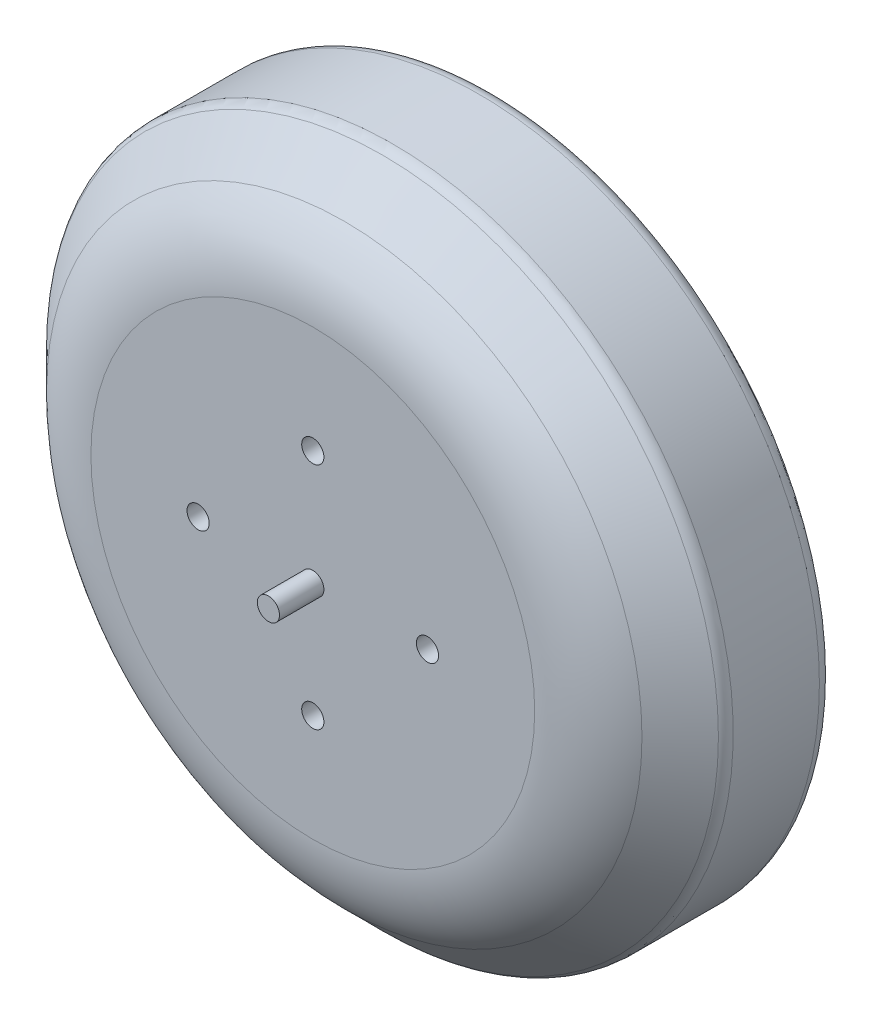
ISO-10303-21;
HEADER;
FILE_DESCRIPTION(('STEP AP214'),'2;1');
FILE_NAME('part.step','',(''),(''),'','','');
FILE_SCHEMA(('AUTOMOTIVE_DESIGN { 1 0 10303 214 1 1 1 1 }'));
ENDSEC;
DATA;
#1=APPLICATION_CONTEXT('core data for automotive mechanical design processes');
#2=APPLICATION_PROTOCOL_DEFINITION('international standard','automotive_design',2000,#1);
#3=PRODUCT_CONTEXT('',#1,'mechanical');
#4=PRODUCT('Part','Part','',(#3));
#5=PRODUCT_RELATED_PRODUCT_CATEGORY('part','',(#4));
#6=PRODUCT_DEFINITION_FORMATION('','',#4);
#7=PRODUCT_DEFINITION_CONTEXT('part definition',#1,'design');
#8=PRODUCT_DEFINITION('design','',#6,#7);
#9=PRODUCT_DEFINITION_SHAPE('','',#8);
#10=(LENGTH_UNIT() NAMED_UNIT(*) SI_UNIT(.MILLI.,.METRE.));
#11=(NAMED_UNIT(*) PLANE_ANGLE_UNIT() SI_UNIT($,.RADIAN.));
#12=(NAMED_UNIT(*) SI_UNIT($,.STERADIAN.) SOLID_ANGLE_UNIT());
#13=UNCERTAINTY_MEASURE_WITH_UNIT(LENGTH_MEASURE(1.E-05),#10,'distance_accuracy_value','');
#14=(GEOMETRIC_REPRESENTATION_CONTEXT(3) GLOBAL_UNCERTAINTY_ASSIGNED_CONTEXT((#13)) GLOBAL_UNIT_ASSIGNED_CONTEXT((#10,
#11,#12)) REPRESENTATION_CONTEXT('',''));
#15=CARTESIAN_POINT('',(0.,0.,0.));
#16=DIRECTION('',(0.,0.,1.));
#17=DIRECTION('',(1.,0.,0.));
#18=AXIS2_PLACEMENT_3D('',#15,#16,#17);
#19=CARTESIAN_POINT('',(0.,0.,-45.5));
#20=DIRECTION('',(0.,0.,1.));
#21=DIRECTION('',(1.,0.,0.));
#22=AXIS2_PLACEMENT_3D('',#19,#20,#21);
#23=PLANE('',#22);
#24=CARTESIAN_POINT('',(0.,-20.,-45.5));
#25=DIRECTION('',(0.,0.,1.));
#26=DIRECTION('',(1.,0.,0.));
#27=AXIS2_PLACEMENT_3D('',#24,#25,#26);
#28=CIRCLE('',#27,2.);
#29=CARTESIAN_POINT('',(-2.,-20.,-45.5));
#30=VERTEX_POINT('',#29);
#31=EDGE_CURVE('E283',#30,#30,#28,.T.);
#32=ORIENTED_EDGE('',*,*,#31,.T.);
#33=EDGE_LOOP('',(#32));
#34=FACE_BOUND('',#33,.T.);
#35=CARTESIAN_POINT('',(20.,0.,-45.5));
#36=DIRECTION('',(0.,0.,1.));
#37=DIRECTION('',(1.,0.,0.));
#38=AXIS2_PLACEMENT_3D('',#35,#36,#37);
#39=CIRCLE('',#38,2.);
#40=CARTESIAN_POINT('',(18.,0.,-45.5));
#41=VERTEX_POINT('',#40);
#42=EDGE_CURVE('E344',#41,#41,#39,.T.);
#43=ORIENTED_EDGE('',*,*,#42,.T.);
#44=EDGE_LOOP('',(#43));
#45=FACE_BOUND('',#44,.T.);
#46=CARTESIAN_POINT('',(-20.,0.,-45.5));
#47=DIRECTION('',(0.,0.,1.));
#48=DIRECTION('',(1.,0.,0.));
#49=AXIS2_PLACEMENT_3D('',#46,#47,#48);
#50=CIRCLE('',#49,2.);
#51=CARTESIAN_POINT('',(-22.,0.,-45.5));
#52=VERTEX_POINT('',#51);
#53=EDGE_CURVE('E297',#52,#52,#50,.T.);
#54=ORIENTED_EDGE('',*,*,#53,.T.);
#55=EDGE_LOOP('',(#54));
#56=FACE_BOUND('',#55,.T.);
#57=CARTESIAN_POINT('',(0.,20.,-45.5));
#58=DIRECTION('',(0.,0.,1.));
#59=DIRECTION('',(1.,0.,0.));
#60=AXIS2_PLACEMENT_3D('',#57,#58,#59);
#61=CIRCLE('',#60,2.);
#62=CARTESIAN_POINT('',(-2.,20.,-45.5));
#63=VERTEX_POINT('',#62);
#64=EDGE_CURVE('E413',#63,#63,#61,.T.);
#65=ORIENTED_EDGE('',*,*,#64,.T.);
#66=EDGE_LOOP('',(#65));
#67=FACE_BOUND('',#66,.T.);
#68=DIRECTION('',(-1.,0.,0.));
#69=VECTOR('',#68,1.);
#70=CARTESIAN_POINT('',(4.90747728811183,-8.5,-45.5));
#71=LINE('',#70,#69);
#72=CARTESIAN_POINT('',(4.90747728811183,-8.5,-45.5));
#73=VERTEX_POINT('',#72);
#74=CARTESIAN_POINT('',(-4.90747728811182,-8.5,-45.5));
#75=VERTEX_POINT('',#74);
#76=EDGE_CURVE('E273',#73,#75,#71,.T.);
#77=ORIENTED_EDGE('',*,*,#76,.F.);
#78=DIRECTION('',(-0.5,-0.866025403784439,0.));
#79=VECTOR('',#78,1.);
#80=CARTESIAN_POINT('',(9.81495457622364,0.,-45.5));
#81=LINE('',#80,#79);
#82=CARTESIAN_POINT('',(9.81495457622364,0.,-45.5));
#83=VERTEX_POINT('',#82);
#84=EDGE_CURVE('E221',#83,#73,#81,.T.);
#85=ORIENTED_EDGE('',*,*,#84,.F.);
#86=DIRECTION('',(0.5,-0.866025403784438,0.));
#87=VECTOR('',#86,1.);
#88=CARTESIAN_POINT('',(4.90747728811182,8.5,-45.5));
#89=LINE('',#88,#87);
#90=CARTESIAN_POINT('',(4.90747728811182,8.5,-45.5));
#91=VERTEX_POINT('',#90);
#92=EDGE_CURVE('E216',#91,#83,#89,.T.);
#93=ORIENTED_EDGE('',*,*,#92,.F.);
#94=DIRECTION('',(1.,0.,0.));
#95=VECTOR('',#94,1.);
#96=CARTESIAN_POINT('',(-4.90747728811182,8.5,-45.5));
#97=LINE('',#96,#95);
#98=CARTESIAN_POINT('',(-4.90747728811182,8.5,-45.5));
#99=VERTEX_POINT('',#98);
#100=EDGE_CURVE('E310',#99,#91,#97,.T.);
#101=ORIENTED_EDGE('',*,*,#100,.F.);
#102=DIRECTION('',(0.5,0.866025403784439,0.));
#103=VECTOR('',#102,1.);
#104=CARTESIAN_POINT('',(-9.81495457622364,0.,-45.5));
#105=LINE('',#104,#103);
#106=CARTESIAN_POINT('',(-9.81495457622364,0.,-45.5));
#107=VERTEX_POINT('',#106);
#108=EDGE_CURVE('E233',#107,#99,#105,.T.);
#109=ORIENTED_EDGE('',*,*,#108,.F.);
#110=DIRECTION('',(-0.5,0.866025403784439,0.));
#111=VECTOR('',#110,1.);
#112=CARTESIAN_POINT('',(-4.90747728811182,-8.5,-45.5));
#113=LINE('',#112,#111);
#114=EDGE_CURVE('E246',#75,#107,#113,.T.);
#115=ORIENTED_EDGE('',*,*,#114,.F.);
#116=EDGE_LOOP('',(#77,#85,#93,#101,#109,#115));
#117=FACE_BOUND('',#116,.T.);
#118=CARTESIAN_POINT('',(0.,0.,-45.5));
#119=DIRECTION('',(0.,0.,1.));
#120=DIRECTION('',(1.,0.,0.));
#121=AXIS2_PLACEMENT_3D('',#118,#119,#120);
#122=CIRCLE('',#121,28.);
#123=CARTESIAN_POINT('',(-28.,0.,-45.5));
#124=VERTEX_POINT('',#123);
#125=EDGE_CURVE('E311',#124,#124,#122,.T.);
#126=ORIENTED_EDGE('',*,*,#125,.F.);
#127=EDGE_LOOP('',(#126));
#128=FACE_BOUND('',#127,.T.);
#129=ADVANCED_FACE('F16',(#34,#45,#56,#67,#117,#128),#23,.F.);
#130=CARTESIAN_POINT('',(0.,0.,-16.5));
#131=DIRECTION('',(0.,0.,1.));
#132=DIRECTION('',(1.,0.,0.));
#133=AXIS2_PLACEMENT_3D('',#130,#131,#132);
#134=PLANE('',#133);
#135=CARTESIAN_POINT('',(-15.5,0.,-16.5));
#136=DIRECTION('',(0.,0.,-1.));
#137=DIRECTION('',(-1.,0.,0.));
#138=AXIS2_PLACEMENT_3D('',#135,#136,#137);
#139=CIRCLE('',#138,1.5);
#140=CARTESIAN_POINT('',(-14.,0.,-16.5));
#141=VERTEX_POINT('',#140);
#142=EDGE_CURVE('E363',#141,#141,#139,.T.);
#143=ORIENTED_EDGE('',*,*,#142,.T.);
#144=EDGE_LOOP('',(#143));
#145=FACE_BOUND('',#144,.T.);
#146=CARTESIAN_POINT('',(0.,15.5,-16.5));
#147=DIRECTION('',(0.,0.,-1.));
#148=DIRECTION('',(-1.,0.,0.));
#149=AXIS2_PLACEMENT_3D('',#146,#147,#148);
#150=CIRCLE('',#149,1.5);
#151=CARTESIAN_POINT('',(1.5,15.5,-16.5));
#152=VERTEX_POINT('',#151);
#153=EDGE_CURVE('E237',#152,#152,#150,.T.);
#154=ORIENTED_EDGE('',*,*,#153,.T.);
#155=EDGE_LOOP('',(#154));
#156=FACE_BOUND('',#155,.T.);
#157=CARTESIAN_POINT('',(0.,-15.5,-16.5));
#158=DIRECTION('',(0.,0.,-1.));
#159=DIRECTION('',(-1.,0.,0.));
#160=AXIS2_PLACEMENT_3D('',#157,#158,#159);
#161=CIRCLE('',#160,1.5);
#162=CARTESIAN_POINT('',(1.5,-15.5,-16.5));
#163=VERTEX_POINT('',#162);
#164=EDGE_CURVE('E320',#163,#163,#161,.T.);
#165=ORIENTED_EDGE('',*,*,#164,.T.);
#166=EDGE_LOOP('',(#165));
#167=FACE_BOUND('',#166,.T.);
#168=CARTESIAN_POINT('',(15.5,0.,-16.5));
#169=DIRECTION('',(0.,0.,-1.));
#170=DIRECTION('',(-1.,0.,0.));
#171=AXIS2_PLACEMENT_3D('',#168,#169,#170);
#172=CIRCLE('',#171,1.5);
#173=CARTESIAN_POINT('',(17.,0.,-16.5));
#174=VERTEX_POINT('',#173);
#175=EDGE_CURVE('E409',#174,#174,#172,.T.);
#176=ORIENTED_EDGE('',*,*,#175,.T.);
#177=EDGE_LOOP('',(#176));
#178=FACE_BOUND('',#177,.T.);
#179=CARTESIAN_POINT('',(0.,0.,-16.5));
#180=DIRECTION('',(0.,0.,-1.));
#181=DIRECTION('',(-1.,0.,0.));
#182=AXIS2_PLACEMENT_3D('',#179,#180,#181);
#183=CIRCLE('',#182,1.5);
#184=CARTESIAN_POINT('',(1.5,0.,-16.5));
#185=VERTEX_POINT('',#184);
#186=EDGE_CURVE('E271',#185,#185,#183,.T.);
#187=ORIENTED_EDGE('',*,*,#186,.T.);
#188=EDGE_LOOP('',(#187));
#189=FACE_BOUND('',#188,.T.);
#190=CARTESIAN_POINT('',(0.,0.,-16.5));
#191=DIRECTION('',(0.,0.,-1.));
#192=DIRECTION('',(1.,0.,0.));
#193=AXIS2_PLACEMENT_3D('',#190,#191,#192);
#194=CIRCLE('',#193,29.9939033455901);
#195=CARTESIAN_POINT('',(29.9939033455901,0.,-16.5));
#196=VERTEX_POINT('',#195);
#197=EDGE_CURVE('E10',#196,#196,#194,.T.);
#198=ORIENTED_EDGE('',*,*,#197,.F.);
#199=EDGE_LOOP('',(#198));
#200=FACE_BOUND('',#199,.T.);
#201=ADVANCED_FACE('F455',(#145,#156,#167,#178,#189,#200),#134,.T.);
#202=CARTESIAN_POINT('',(0.,0.,-31.));
#203=DIRECTION('',(0.,0.,-1.));
#204=DIRECTION('',(-1.,0.,0.));
#205=AXIS2_PLACEMENT_3D('',#202,#203,#204);
#206=TOROIDAL_SURFACE('',#205,29.9939033455901,14.5);
#207=CARTESIAN_POINT('',(0.,0.,-20.7469516727951));
#208=DIRECTION('',(0.,0.,1.));
#209=DIRECTION('',(1.,0.,0.));
#210=AXIS2_PLACEMENT_3D('',#207,#208,#209);
#211=CIRCLE('',#210,40.2469516727951);
#212=CARTESIAN_POINT('',(-40.2469516727951,0.,-20.7469516727951));
#213=VERTEX_POINT('',#212);
#214=CARTESIAN_POINT('',(40.2469516727951,0.,-20.7469516727951));
#215=VERTEX_POINT('',#214);
#216=EDGE_CURVE('E287',#213,#215,#211,.T.);
#217=ORIENTED_EDGE('',*,*,#216,.T.);
#218=CARTESIAN_POINT('',(29.9939033455901,0.,-31.));
#219=DIRECTION('',(0.,-1.,0.));
#220=DIRECTION('',(1.,0.,0.));
#221=AXIS2_PLACEMENT_3D('',#218,#219,#220);
#222=CIRCLE('',#221,14.5);
#223=EDGE_CURVE('E27',#215,#196,#222,.T.);
#224=ORIENTED_EDGE('',*,*,#223,.T.);
#225=ORIENTED_EDGE('',*,*,#197,.T.);
#226=ORIENTED_EDGE('',*,*,#223,.F.);
#227=CARTESIAN_POINT('',(0.,0.,-20.7469516727951));
#228=DIRECTION('',(0.,0.,1.));
#229=DIRECTION('',(1.,0.,0.));
#230=AXIS2_PLACEMENT_3D('',#227,#228,#229);
#231=CIRCLE('',#230,40.2469516727951);
#232=EDGE_CURVE('E296',#215,#213,#231,.T.);
#233=ORIENTED_EDGE('',*,*,#232,.T.);
#234=EDGE_LOOP('',(#217,#224,#225,#226,#233));
#235=FACE_BOUND('',#234,.T.);
#236=ADVANCED_FACE('F458',(#235),#206,.T.);
#237=CARTESIAN_POINT('',(0.,0.,-49.5));
#238=DIRECTION('',(0.,0.,-1.));
#239=DIRECTION('',(0.,-1.,0.));
#240=AXIS2_PLACEMENT_3D('',#237,#238,#239);
#241=PLANE('',#240);
#242=DIRECTION('',(-0.5,-0.866025403784439,0.));
#243=VECTOR('',#242,1.);
#244=CARTESIAN_POINT('',(8.58808525419569,-2.125,-49.5));
#245=LINE('',#244,#243);
#246=CARTESIAN_POINT('',(9.81495457622364,0.,-49.5));
#247=VERTEX_POINT('',#246);
#248=CARTESIAN_POINT('',(4.90747728811183,-8.5,-49.5));
#249=VERTEX_POINT('',#248);
#250=EDGE_CURVE('E202',#247,#249,#245,.T.);
#251=ORIENTED_EDGE('',*,*,#250,.T.);
#252=DIRECTION('',(-1.,0.,0.));
#253=VECTOR('',#252,1.);
#254=CARTESIAN_POINT('',(2.45373864405591,-8.5,-49.5));
#255=LINE('',#254,#253);
#256=CARTESIAN_POINT('',(-4.90747728811182,-8.5,-49.5));
#257=VERTEX_POINT('',#256);
#258=EDGE_CURVE('E255',#249,#257,#255,.T.);
#259=ORIENTED_EDGE('',*,*,#258,.T.);
#260=DIRECTION('',(-0.5,0.866025403784439,0.));
#261=VECTOR('',#260,1.);
#262=CARTESIAN_POINT('',(-6.13434661013977,-6.375,-49.5));
#263=LINE('',#262,#261);
#264=CARTESIAN_POINT('',(-9.81495457622364,0.,-49.5));
#265=VERTEX_POINT('',#264);
#266=EDGE_CURVE('E247',#257,#265,#263,.T.);
#267=ORIENTED_EDGE('',*,*,#266,.T.);
#268=DIRECTION('',(0.5,0.866025403784439,0.));
#269=VECTOR('',#268,1.);
#270=CARTESIAN_POINT('',(-8.58808525419568,2.125,-49.5));
#271=LINE('',#270,#269);
#272=CARTESIAN_POINT('',(-4.90747728811182,8.5,-49.5));
#273=VERTEX_POINT('',#272);
#274=EDGE_CURVE('E307',#265,#273,#271,.T.);
#275=ORIENTED_EDGE('',*,*,#274,.T.);
#276=DIRECTION('',(1.,0.,0.));
#277=VECTOR('',#276,1.);
#278=CARTESIAN_POINT('',(-2.45373864405591,8.5,-49.5));
#279=LINE('',#278,#277);
#280=CARTESIAN_POINT('',(4.90747728811182,8.5,-49.5));
#281=VERTEX_POINT('',#280);
#282=EDGE_CURVE('E204',#273,#281,#279,.T.);
#283=ORIENTED_EDGE('',*,*,#282,.T.);
#284=DIRECTION('',(0.5,-0.866025403784438,0.));
#285=VECTOR('',#284,1.);
#286=CARTESIAN_POINT('',(6.13434661013977,6.375,-49.5));
#287=LINE('',#286,#285);
#288=EDGE_CURVE('E198',#281,#247,#287,.T.);
#289=ORIENTED_EDGE('',*,*,#288,.T.);
#290=EDGE_LOOP('',(#251,#259,#267,#275,#283,#289));
#291=FACE_BOUND('',#290,.T.);
#292=ADVANCED_FACE('F200',(#291),#241,.T.);
#293=CARTESIAN_POINT('',(0.,-20.,-35.5));
#294=DIRECTION('',(0.,0.,-1.));
#295=DIRECTION('',(0.,-1.,0.));
#296=AXIS2_PLACEMENT_3D('',#293,#294,#295);
#297=PLANE('',#296);
#298=CARTESIAN_POINT('',(0.,-20.,-35.5));
#299=DIRECTION('',(0.,0.,1.));
#300=DIRECTION('',(1.,0.,0.));
#301=AXIS2_PLACEMENT_3D('',#298,#299,#300);
#302=CIRCLE('',#301,2.);
#303=CARTESIAN_POINT('',(-2.,-20.,-35.5));
#304=VERTEX_POINT('',#303);
#305=EDGE_CURVE('E362',#304,#304,#302,.T.);
#306=ORIENTED_EDGE('',*,*,#305,.F.);
#307=EDGE_LOOP('',(#306));
#308=FACE_BOUND('',#307,.T.);
#309=ADVANCED_FACE('F515',(#308),#297,.T.);
#310=CARTESIAN_POINT('',(0.,-20.,-45.5));
#311=DIRECTION('',(0.,0.,1.));
#312=DIRECTION('',(1.,0.,0.));
#313=AXIS2_PLACEMENT_3D('',#310,#311,#312);
#314=CYLINDRICAL_SURFACE('',#313,2.);
#315=ORIENTED_EDGE('',*,*,#31,.F.);
#316=DIRECTION('',(0.,0.,1.));
#317=VECTOR('',#316,1.);
#318=CARTESIAN_POINT('',(-2.,-20.,-45.5));
#319=LINE('',#318,#317);
#320=EDGE_CURVE('E354',#30,#304,#319,.T.);
#321=ORIENTED_EDGE('',*,*,#320,.T.);
#322=ORIENTED_EDGE('',*,*,#305,.T.);
#323=ORIENTED_EDGE('',*,*,#320,.F.);
#324=EDGE_LOOP('',(#315,#321,#322,#323));
#325=FACE_BOUND('',#324,.T.);
#326=ADVANCED_FACE('F531',(#325),#314,.F.);
#327=CARTESIAN_POINT('',(20.,0.,-35.5));
#328=DIRECTION('',(0.,0.,-1.));
#329=DIRECTION('',(0.,-1.,0.));
#330=AXIS2_PLACEMENT_3D('',#327,#328,#329);
#331=PLANE('',#330);
#332=CARTESIAN_POINT('',(20.,0.,-35.5));
#333=DIRECTION('',(0.,0.,1.));
#334=DIRECTION('',(1.,0.,0.));
#335=AXIS2_PLACEMENT_3D('',#332,#333,#334);
#336=CIRCLE('',#335,2.);
#337=CARTESIAN_POINT('',(18.,0.,-35.5));
#338=VERTEX_POINT('',#337);
#339=EDGE_CURVE('E279',#338,#338,#336,.T.);
#340=ORIENTED_EDGE('',*,*,#339,.F.);
#341=EDGE_LOOP('',(#340));
#342=FACE_BOUND('',#341,.T.);
#343=ADVANCED_FACE('F527',(#342),#331,.T.);
#344=CARTESIAN_POINT('',(20.,0.,-45.5));
#345=DIRECTION('',(0.,0.,1.));
#346=DIRECTION('',(1.,0.,0.));
#347=AXIS2_PLACEMENT_3D('',#344,#345,#346);
#348=CYLINDRICAL_SURFACE('',#347,2.);
#349=ORIENTED_EDGE('',*,*,#42,.F.);
#350=DIRECTION('',(0.,0.,1.));
#351=VECTOR('',#350,1.);
#352=CARTESIAN_POINT('',(18.,0.,-45.5));
#353=LINE('',#352,#351);
#354=EDGE_CURVE('E284',#41,#338,#353,.T.);
#355=ORIENTED_EDGE('',*,*,#354,.T.);
#356=ORIENTED_EDGE('',*,*,#339,.T.);
#357=ORIENTED_EDGE('',*,*,#354,.F.);
#358=EDGE_LOOP('',(#349,#355,#356,#357));
#359=FACE_BOUND('',#358,.T.);
#360=ADVANCED_FACE('F530',(#359),#348,.F.);
#361=CARTESIAN_POINT('',(-20.,0.,-35.5));
#362=DIRECTION('',(0.,0.,-1.));
#363=DIRECTION('',(0.,-1.,0.));
#364=AXIS2_PLACEMENT_3D('',#361,#362,#363);
#365=PLANE('',#364);
#366=CARTESIAN_POINT('',(-20.,0.,-35.5));
#367=DIRECTION('',(0.,0.,1.));
#368=DIRECTION('',(1.,0.,0.));
#369=AXIS2_PLACEMENT_3D('',#366,#367,#368);
#370=CIRCLE('',#369,2.);
#371=CARTESIAN_POINT('',(-22.,0.,-35.5));
#372=VERTEX_POINT('',#371);
#373=EDGE_CURVE('E355',#372,#372,#370,.T.);
#374=ORIENTED_EDGE('',*,*,#373,.F.);
#375=EDGE_LOOP('',(#374));
#376=FACE_BOUND('',#375,.T.);
#377=ADVANCED_FACE('F489',(#376),#365,.T.);
#378=CARTESIAN_POINT('',(-20.,0.,-45.5));
#379=DIRECTION('',(0.,0.,1.));
#380=DIRECTION('',(1.,0.,0.));
#381=AXIS2_PLACEMENT_3D('',#378,#379,#380);
#382=CYLINDRICAL_SURFACE('',#381,2.);
#383=ORIENTED_EDGE('',*,*,#53,.F.);
#384=DIRECTION('',(0.,0.,1.));
#385=VECTOR('',#384,1.);
#386=CARTESIAN_POINT('',(-22.,0.,-45.5));
#387=LINE('',#386,#385);
#388=EDGE_CURVE('E301',#52,#372,#387,.T.);
#389=ORIENTED_EDGE('',*,*,#388,.T.);
#390=ORIENTED_EDGE('',*,*,#373,.T.);
#391=ORIENTED_EDGE('',*,*,#388,.F.);
#392=EDGE_LOOP('',(#383,#389,#390,#391));
#393=FACE_BOUND('',#392,.T.);
#394=ADVANCED_FACE('F485',(#393),#382,.F.);
#395=CARTESIAN_POINT('',(0.,20.,-35.5));
#396=DIRECTION('',(0.,0.,-1.));
#397=DIRECTION('',(0.,-1.,0.));
#398=AXIS2_PLACEMENT_3D('',#395,#396,#397);
#399=PLANE('',#398);
#400=CARTESIAN_POINT('',(0.,20.,-35.5));
#401=DIRECTION('',(0.,0.,1.));
#402=DIRECTION('',(1.,0.,0.));
#403=AXIS2_PLACEMENT_3D('',#400,#401,#402);
#404=CIRCLE('',#403,2.);
#405=CARTESIAN_POINT('',(-2.,20.,-35.5));
#406=VERTEX_POINT('',#405);
#407=EDGE_CURVE('E302',#406,#406,#404,.T.);
#408=ORIENTED_EDGE('',*,*,#407,.F.);
#409=EDGE_LOOP('',(#408));
#410=FACE_BOUND('',#409,.T.);
#411=ADVANCED_FACE('F488',(#410),#399,.T.);
#412=CARTESIAN_POINT('',(0.,20.,-45.5));
#413=DIRECTION('',(0.,0.,1.));
#414=DIRECTION('',(1.,0.,0.));
#415=AXIS2_PLACEMENT_3D('',#412,#413,#414);
#416=CYLINDRICAL_SURFACE('',#415,2.);
#417=ORIENTED_EDGE('',*,*,#64,.F.);
#418=DIRECTION('',(0.,0.,1.));
#419=VECTOR('',#418,1.);
#420=CARTESIAN_POINT('',(-2.,20.,-45.5));
#421=LINE('',#420,#419);
#422=EDGE_CURVE('E350',#63,#406,#421,.T.);
#423=ORIENTED_EDGE('',*,*,#422,.T.);
#424=ORIENTED_EDGE('',*,*,#407,.T.);
#425=ORIENTED_EDGE('',*,*,#422,.F.);
#426=EDGE_LOOP('',(#417,#423,#424,#425));
#427=FACE_BOUND('',#426,.T.);
#428=ADVANCED_FACE('F493',(#427),#416,.F.);
#429=CARTESIAN_POINT('',(-15.5,0.,-26.5));
#430=DIRECTION('',(0.,0.,1.));
#431=DIRECTION('',(1.,0.,0.));
#432=AXIS2_PLACEMENT_3D('',#429,#430,#431);
#433=PLANE('',#432);
#434=CARTESIAN_POINT('',(-15.5,0.,-26.5));
#435=DIRECTION('',(0.,0.,-1.));
#436=DIRECTION('',(-1.,0.,0.));
#437=AXIS2_PLACEMENT_3D('',#434,#435,#436);
#438=CIRCLE('',#437,1.5);
#439=CARTESIAN_POINT('',(-14.,0.,-26.5));
#440=VERTEX_POINT('',#439);
#441=EDGE_CURVE('E410',#440,#440,#438,.T.);
#442=ORIENTED_EDGE('',*,*,#441,.F.);
#443=EDGE_LOOP('',(#442));
#444=FACE_BOUND('',#443,.T.);
#445=ADVANCED_FACE('F506',(#444),#433,.T.);
#446=CARTESIAN_POINT('',(-15.5,0.,-16.5));
#447=DIRECTION('',(0.,0.,-1.));
#448=DIRECTION('',(-1.,0.,0.));
#449=AXIS2_PLACEMENT_3D('',#446,#447,#448);
#450=CYLINDRICAL_SURFACE('',#449,1.5);
#451=ORIENTED_EDGE('',*,*,#142,.F.);
#452=DIRECTION('',(0.,0.,-1.));
#453=VECTOR('',#452,1.);
#454=CARTESIAN_POINT('',(-14.,0.,-16.5));
#455=LINE('',#454,#453);
#456=EDGE_CURVE('E367',#141,#440,#455,.T.);
#457=ORIENTED_EDGE('',*,*,#456,.T.);
#458=ORIENTED_EDGE('',*,*,#441,.T.);
#459=ORIENTED_EDGE('',*,*,#456,.F.);
#460=EDGE_LOOP('',(#451,#457,#458,#459));
#461=FACE_BOUND('',#460,.T.);
#462=ADVANCED_FACE('F510',(#461),#450,.F.);
#463=CARTESIAN_POINT('',(0.,15.5,-26.5));
#464=DIRECTION('',(0.,0.,1.));
#465=DIRECTION('',(1.,0.,0.));
#466=AXIS2_PLACEMENT_3D('',#463,#464,#465);
#467=PLANE('',#466);
#468=CARTESIAN_POINT('',(0.,15.5,-26.5));
#469=DIRECTION('',(0.,0.,-1.));
#470=DIRECTION('',(-1.,0.,0.));
#471=AXIS2_PLACEMENT_3D('',#468,#469,#470);
#472=CIRCLE('',#471,1.5);
#473=CARTESIAN_POINT('',(1.5,15.5,-26.5));
#474=VERTEX_POINT('',#473);
#475=EDGE_CURVE('E368',#474,#474,#472,.T.);
#476=ORIENTED_EDGE('',*,*,#475,.F.);
#477=EDGE_LOOP('',(#476));
#478=FACE_BOUND('',#477,.T.);
#479=ADVANCED_FACE('F552',(#478),#467,.T.);
#480=CARTESIAN_POINT('',(0.,15.5,-16.5));
#481=DIRECTION('',(0.,0.,-1.));
#482=DIRECTION('',(-1.,0.,0.));
#483=AXIS2_PLACEMENT_3D('',#480,#481,#482);
#484=CYLINDRICAL_SURFACE('',#483,1.5);
#485=ORIENTED_EDGE('',*,*,#153,.F.);
#486=DIRECTION('',(0.,0.,-1.));
#487=VECTOR('',#486,1.);
#488=CARTESIAN_POINT('',(1.5,15.5,-16.5));
#489=LINE('',#488,#487);
#490=EDGE_CURVE('E306',#152,#474,#489,.T.);
#491=ORIENTED_EDGE('',*,*,#490,.T.);
#492=ORIENTED_EDGE('',*,*,#475,.T.);
#493=ORIENTED_EDGE('',*,*,#490,.F.);
#494=EDGE_LOOP('',(#485,#491,#492,#493));
#495=FACE_BOUND('',#494,.T.);
#496=ADVANCED_FACE('F520',(#495),#484,.F.);
#497=CARTESIAN_POINT('',(0.,-15.5,-26.5));
#498=DIRECTION('',(0.,0.,1.));
#499=DIRECTION('',(1.,0.,0.));
#500=AXIS2_PLACEMENT_3D('',#497,#498,#499);
#501=PLANE('',#500);
#502=CARTESIAN_POINT('',(0.,-15.5,-26.5));
#503=DIRECTION('',(0.,0.,-1.));
#504=DIRECTION('',(-1.,0.,0.));
#505=AXIS2_PLACEMENT_3D('',#502,#503,#504);
#506=CIRCLE('',#505,1.5);
#507=CARTESIAN_POINT('',(1.5,-15.5,-26.5));
#508=VERTEX_POINT('',#507);
#509=EDGE_CURVE('E235',#508,#508,#506,.T.);
#510=ORIENTED_EDGE('',*,*,#509,.F.);
#511=EDGE_LOOP('',(#510));
#512=FACE_BOUND('',#511,.T.);
#513=ADVANCED_FACE('F517',(#512),#501,.T.);
#514=CARTESIAN_POINT('',(0.,-15.5,-16.5));
#515=DIRECTION('',(0.,0.,-1.));
#516=DIRECTION('',(-1.,0.,0.));
#517=AXIS2_PLACEMENT_3D('',#514,#515,#516);
#518=CYLINDRICAL_SURFACE('',#517,1.5);
#519=ORIENTED_EDGE('',*,*,#164,.F.);
#520=DIRECTION('',(0.,0.,-1.));
#521=VECTOR('',#520,1.);
#522=CARTESIAN_POINT('',(1.5,-15.5,-16.5));
#523=LINE('',#522,#521);
#524=EDGE_CURVE('E238',#163,#508,#523,.T.);
#525=ORIENTED_EDGE('',*,*,#524,.T.);
#526=ORIENTED_EDGE('',*,*,#509,.T.);
#527=ORIENTED_EDGE('',*,*,#524,.F.);
#528=EDGE_LOOP('',(#519,#525,#526,#527));
#529=FACE_BOUND('',#528,.T.);
#530=ADVANCED_FACE('F519',(#529),#518,.F.);
#531=CARTESIAN_POINT('',(15.5,0.,-26.5));
#532=DIRECTION('',(0.,0.,1.));
#533=DIRECTION('',(1.,0.,0.));
#534=AXIS2_PLACEMENT_3D('',#531,#532,#533);
#535=PLANE('',#534);
#536=CARTESIAN_POINT('',(15.5,0.,-26.5));
#537=DIRECTION('',(0.,0.,-1.));
#538=DIRECTION('',(-1.,0.,0.));
#539=AXIS2_PLACEMENT_3D('',#536,#537,#538);
#540=CIRCLE('',#539,1.5);
#541=CARTESIAN_POINT('',(17.,0.,-26.5));
#542=VERTEX_POINT('',#541);
#543=EDGE_CURVE('E317',#542,#542,#540,.T.);
#544=ORIENTED_EDGE('',*,*,#543,.F.);
#545=EDGE_LOOP('',(#544));
#546=FACE_BOUND('',#545,.T.);
#547=ADVANCED_FACE('F523',(#546),#535,.T.);
#548=CARTESIAN_POINT('',(15.5,0.,-16.5));
#549=DIRECTION('',(0.,0.,-1.));
#550=DIRECTION('',(-1.,0.,0.));
#551=AXIS2_PLACEMENT_3D('',#548,#549,#550);
#552=CYLINDRICAL_SURFACE('',#551,1.5);
#553=ORIENTED_EDGE('',*,*,#175,.F.);
#554=DIRECTION('',(0.,0.,-1.));
#555=VECTOR('',#554,1.);
#556=CARTESIAN_POINT('',(17.,0.,-16.5));
#557=LINE('',#556,#555);
#558=EDGE_CURVE('E321',#174,#542,#557,.T.);
#559=ORIENTED_EDGE('',*,*,#558,.T.);
#560=ORIENTED_EDGE('',*,*,#543,.T.);
#561=ORIENTED_EDGE('',*,*,#558,.F.);
#562=EDGE_LOOP('',(#553,#559,#560,#561));
#563=FACE_BOUND('',#562,.T.);
#564=ADVANCED_FACE('F452',(#563),#552,.F.);
#565=CARTESIAN_POINT('',(0.,0.,-10.5));
#566=DIRECTION('',(0.,0.,1.));
#567=DIRECTION('',(1.,0.,0.));
#568=AXIS2_PLACEMENT_3D('',#565,#566,#567);
#569=PLANE('',#568);
#570=CARTESIAN_POINT('',(0.,0.,-10.5));
#571=DIRECTION('',(0.,0.,1.));
#572=DIRECTION('',(-1.,0.,0.));
#573=AXIS2_PLACEMENT_3D('',#570,#571,#572);
#574=CIRCLE('',#573,1.5);
#575=CARTESIAN_POINT('',(1.5,0.,-10.5));
#576=VERTEX_POINT('',#575);
#577=EDGE_CURVE('E272',#576,#576,#574,.T.);
#578=ORIENTED_EDGE('',*,*,#577,.T.);
#579=EDGE_LOOP('',(#578));
#580=FACE_BOUND('',#579,.T.);
#581=ADVANCED_FACE('F540',(#580),#569,.T.);
#582=CARTESIAN_POINT('',(0.,0.,-16.5));
#583=DIRECTION('',(0.,0.,1.));
#584=DIRECTION('',(-1.,0.,0.));
#585=AXIS2_PLACEMENT_3D('',#582,#583,#584);
#586=CYLINDRICAL_SURFACE('',#585,1.5);
#587=ORIENTED_EDGE('',*,*,#577,.F.);
#588=DIRECTION('',(0.,0.,-1.));
#589=VECTOR('',#588,1.);
#590=CARTESIAN_POINT('',(1.5,0.,-16.5));
#591=LINE('',#590,#589);
#592=EDGE_CURVE('E267',#576,#185,#591,.T.);
#593=ORIENTED_EDGE('',*,*,#592,.T.);
#594=ORIENTED_EDGE('',*,*,#186,.F.);
#595=ORIENTED_EDGE('',*,*,#592,.F.);
#596=EDGE_LOOP('',(#587,#593,#594,#595));
#597=FACE_BOUND('',#596,.T.);
#598=ADVANCED_FACE('F477',(#597),#586,.T.);
#599=CARTESIAN_POINT('',(0.,0.,-21.5));
#600=DIRECTION('',(0.,0.,-1.));
#601=DIRECTION('',(1.,0.,0.));
#602=AXIS2_PLACEMENT_3D('',#599,#600,#601);
#603=CONICAL_SURFACE('',#602,41.,0.785398163397448);
#604=ORIENTED_EDGE('',*,*,#216,.F.);
#605=DIRECTION('',(-0.707106781186548,0.,-0.707106781186548));
#606=VECTOR('',#605,1.);
#607=CARTESIAN_POINT('',(-41.,0.,-21.5));
#608=LINE('',#607,#606);
#609=CARTESIAN_POINT('',(-45.4142135623731,0.,-25.9142135623731));
#610=VERTEX_POINT('',#609);
#611=EDGE_CURVE('E326',#213,#610,#608,.T.);
#612=ORIENTED_EDGE('',*,*,#611,.T.);
#613=CARTESIAN_POINT('',(0.,0.,-25.9142135623731));
#614=DIRECTION('',(0.,0.,-1.));
#615=DIRECTION('',(1.,0.,0.));
#616=AXIS2_PLACEMENT_3D('',#613,#614,#615);
#617=CIRCLE('',#616,45.4142135623731);
#618=EDGE_CURVE('E288',#610,#610,#617,.T.);
#619=ORIENTED_EDGE('',*,*,#618,.F.);
#620=ORIENTED_EDGE('',*,*,#611,.F.);
#621=ORIENTED_EDGE('',*,*,#232,.F.);
#622=EDGE_LOOP('',(#604,#612,#619,#620,#621));
#623=FACE_BOUND('',#622,.T.);
#624=ADVANCED_FACE('F467',(#623),#603,.T.);
#625=CARTESIAN_POINT('',(0.,0.,-27.3284271247462));
#626=DIRECTION('',(0.,0.,1.));
#627=DIRECTION('',(1.,0.,0.));
#628=AXIS2_PLACEMENT_3D('',#625,#626,#627);
#629=TOROIDAL_SURFACE('',#628,44.,2.);
#630=ORIENTED_EDGE('',*,*,#618,.T.);
#631=CARTESIAN_POINT('',(-44.,0.,-27.3284271247462));
#632=DIRECTION('',(0.,-1.,0.));
#633=DIRECTION('',(-1.,0.,0.));
#634=AXIS2_PLACEMENT_3D('',#631,#632,#633);
#635=CIRCLE('',#634,2.);
#636=CARTESIAN_POINT('',(-46.,0.,-27.3284271247462));
#637=VERTEX_POINT('',#636);
#638=EDGE_CURVE('E132',#610,#637,#635,.T.);
#639=ORIENTED_EDGE('',*,*,#638,.T.);
#640=CARTESIAN_POINT('',(0.,0.,-27.3284271247462));
#641=DIRECTION('',(0.,0.,1.));
#642=DIRECTION('',(1.,0.,0.));
#643=AXIS2_PLACEMENT_3D('',#640,#641,#642);
#644=CIRCLE('',#643,46.);
#645=EDGE_CURVE('E242',#637,#637,#644,.T.);
#646=ORIENTED_EDGE('',*,*,#645,.T.);
#647=ORIENTED_EDGE('',*,*,#638,.F.);
#648=EDGE_LOOP('',(#630,#639,#646,#647));
#649=FACE_BOUND('',#648,.T.);
#650=ADVANCED_FACE('F18',(#649),#629,.T.);
#651=CARTESIAN_POINT('',(0.,0.,-43.));
#652=DIRECTION('',(0.,0.,1.));
#653=DIRECTION('',(1.,0.,0.));
#654=AXIS2_PLACEMENT_3D('',#651,#652,#653);
#655=CONICAL_SURFACE('',#654,37.,1.29984947645648);
#656=CARTESIAN_POINT('',(0.,0.,-40.9068645201188));
#657=DIRECTION('',(0.,0.,1.));
#658=DIRECTION('',(1.,0.,0.));
#659=AXIS2_PLACEMENT_3D('',#656,#657,#658);
#660=CIRCLE('',#659,44.5352877275722);
#661=CARTESIAN_POINT('',(-44.5352877275722,0.,-40.9068645201188));
#662=VERTEX_POINT('',#661);
#663=CARTESIAN_POINT('',(44.5352877275722,0.,-40.9068645201188));
#664=VERTEX_POINT('',#663);
#665=EDGE_CURVE('E276',#662,#664,#660,.T.);
#666=ORIENTED_EDGE('',*,*,#665,.F.);
#667=DIRECTION('',(0.963517909629941,0.,-0.267643863786095));
#668=VECTOR('',#667,1.);
#669=CARTESIAN_POINT('',(-37.,0.,-43.));
#670=LINE('',#669,#668);
#671=EDGE_CURVE('E241',#662,#124,#670,.T.);
#672=ORIENTED_EDGE('',*,*,#671,.T.);
#673=ORIENTED_EDGE('',*,*,#125,.T.);
#674=ORIENTED_EDGE('',*,*,#671,.F.);
#675=CARTESIAN_POINT('',(0.,0.,-40.9068645201188));
#676=DIRECTION('',(0.,0.,1.));
#677=DIRECTION('',(1.,0.,0.));
#678=AXIS2_PLACEMENT_3D('',#675,#676,#677);
#679=CIRCLE('',#678,44.5352877275722);
#680=EDGE_CURVE('E20',#664,#662,#679,.T.);
#681=ORIENTED_EDGE('',*,*,#680,.F.);
#682=EDGE_LOOP('',(#666,#672,#673,#674,#681));
#683=FACE_BOUND('',#682,.T.);
#684=ADVANCED_FACE('F386',(#683),#655,.T.);
#685=CARTESIAN_POINT('',(0.,0.,-45.5));
#686=DIRECTION('',(0.,0.,1.));
#687=DIRECTION('',(1.,0.,0.));
#688=AXIS2_PLACEMENT_3D('',#685,#686,#687);
#689=CYLINDRICAL_SURFACE('',#688,46.);
#690=ORIENTED_EDGE('',*,*,#645,.F.);
#691=DIRECTION('',(0.,0.,-1.));
#692=VECTOR('',#691,1.);
#693=CARTESIAN_POINT('',(-46.,0.,-45.5));
#694=LINE('',#693,#692);
#695=CARTESIAN_POINT('',(-46.,0.,-38.979828700859));
#696=VERTEX_POINT('',#695);
#697=EDGE_CURVE('E144',#637,#696,#694,.T.);
#698=ORIENTED_EDGE('',*,*,#697,.T.);
#699=CARTESIAN_POINT('',(0.,0.,-38.979828700859));
#700=DIRECTION('',(0.,0.,-1.));
#701=DIRECTION('',(1.,0.,0.));
#702=AXIS2_PLACEMENT_3D('',#699,#700,#701);
#703=CIRCLE('',#702,46.);
#704=CARTESIAN_POINT('',(46.,0.,-38.979828700859));
#705=VERTEX_POINT('',#704);
#706=EDGE_CURVE('E292',#705,#696,#703,.T.);
#707=ORIENTED_EDGE('',*,*,#706,.F.);
#708=CARTESIAN_POINT('',(0.,0.,-38.979828700859));
#709=DIRECTION('',(0.,0.,-1.));
#710=DIRECTION('',(1.,0.,0.));
#711=AXIS2_PLACEMENT_3D('',#708,#709,#710);
#712=CIRCLE('',#711,46.);
#713=EDGE_CURVE('E289',#696,#705,#712,.T.);
#714=ORIENTED_EDGE('',*,*,#713,.F.);
#715=ORIENTED_EDGE('',*,*,#697,.F.);
#716=EDGE_LOOP('',(#690,#698,#707,#714,#715));
#717=FACE_BOUND('',#716,.T.);
#718=ADVANCED_FACE('F475',(#717),#689,.T.);
#719=CARTESIAN_POINT('',(0.,0.,-38.979828700859));
#720=DIRECTION('',(0.,0.,-1.));
#721=DIRECTION('',(-1.,0.,0.));
#722=AXIS2_PLACEMENT_3D('',#719,#720,#721);
#723=TOROIDAL_SURFACE('',#722,44.,2.);
#724=ORIENTED_EDGE('',*,*,#665,.T.);
#725=CARTESIAN_POINT('',(44.,0.,-38.979828700859));
#726=DIRECTION('',(0.,-1.,0.));
#727=DIRECTION('',(1.,0.,0.));
#728=AXIS2_PLACEMENT_3D('',#725,#726,#727);
#729=CIRCLE('',#728,2.);
#730=EDGE_CURVE('E383',#664,#705,#729,.T.);
#731=ORIENTED_EDGE('',*,*,#730,.T.);
#732=ORIENTED_EDGE('',*,*,#706,.T.);
#733=ORIENTED_EDGE('',*,*,#713,.T.);
#734=ORIENTED_EDGE('',*,*,#730,.F.);
#735=ORIENTED_EDGE('',*,*,#680,.T.);
#736=EDGE_LOOP('',(#724,#731,#732,#733,#734,#735));
#737=FACE_BOUND('',#736,.T.);
#738=ADVANCED_FACE('F381',(#737),#723,.T.);
#739=CARTESIAN_POINT('',(4.90747728811183,-8.5,-49.5));
#740=DIRECTION('',(0.,1.,0.));
#741=DIRECTION('',(1.,0.,0.));
#742=AXIS2_PLACEMENT_3D('',#739,#740,#741);
#743=PLANE('',#742);
#744=ORIENTED_EDGE('',*,*,#258,.F.);
#745=DIRECTION('',(0.,0.,1.));
#746=VECTOR('',#745,1.);
#747=CARTESIAN_POINT('',(4.90747728811183,-8.5,-49.5));
#748=LINE('',#747,#746);
#749=EDGE_CURVE('E210',#249,#73,#748,.T.);
#750=ORIENTED_EDGE('',*,*,#749,.T.);
#751=ORIENTED_EDGE('',*,*,#76,.T.);
#752=DIRECTION('',(0.,0.,1.));
#753=VECTOR('',#752,1.);
#754=CARTESIAN_POINT('',(-4.90747728811182,-8.5,-49.5));
#755=LINE('',#754,#753);
#756=EDGE_CURVE('E243',#257,#75,#755,.T.);
#757=ORIENTED_EDGE('',*,*,#756,.F.);
#758=EDGE_LOOP('',(#744,#750,#751,#757));
#759=FACE_BOUND('',#758,.T.);
#760=ADVANCED_FACE('F499',(#759),#743,.F.);
#761=CARTESIAN_POINT('',(-4.90747728811182,-8.5,-49.5));
#762=DIRECTION('',(0.866025403784439,0.5,0.));
#763=DIRECTION('',(0.,0.,-1.));
#764=AXIS2_PLACEMENT_3D('',#761,#762,#763);
#765=PLANE('',#764);
#766=ORIENTED_EDGE('',*,*,#266,.F.);
#767=ORIENTED_EDGE('',*,*,#756,.T.);
#768=ORIENTED_EDGE('',*,*,#114,.T.);
#769=DIRECTION('',(0.,0.,1.));
#770=VECTOR('',#769,1.);
#771=CARTESIAN_POINT('',(-9.81495457622364,0.,-49.5));
#772=LINE('',#771,#770);
#773=EDGE_CURVE('E263',#265,#107,#772,.T.);
#774=ORIENTED_EDGE('',*,*,#773,.F.);
#775=EDGE_LOOP('',(#766,#767,#768,#774));
#776=FACE_BOUND('',#775,.T.);
#777=ADVANCED_FACE('F495',(#776),#765,.F.);
#778=CARTESIAN_POINT('',(-9.81495457622364,0.,-49.5));
#779=DIRECTION('',(0.866025403784439,-0.5,0.));
#780=DIRECTION('',(0.,0.,-1.));
#781=AXIS2_PLACEMENT_3D('',#778,#779,#780);
#782=PLANE('',#781);
#783=ORIENTED_EDGE('',*,*,#274,.F.);
#784=ORIENTED_EDGE('',*,*,#773,.T.);
#785=ORIENTED_EDGE('',*,*,#108,.T.);
#786=DIRECTION('',(0.,0.,1.));
#787=VECTOR('',#786,1.);
#788=CARTESIAN_POINT('',(-4.90747728811182,8.5,-49.5));
#789=LINE('',#788,#787);
#790=EDGE_CURVE('E316',#273,#99,#789,.T.);
#791=ORIENTED_EDGE('',*,*,#790,.F.);
#792=EDGE_LOOP('',(#783,#784,#785,#791));
#793=FACE_BOUND('',#792,.T.);
#794=ADVANCED_FACE('F498',(#793),#782,.F.);
#795=CARTESIAN_POINT('',(-4.90747728811182,8.5,-49.5));
#796=DIRECTION('',(0.,-1.,0.));
#797=DIRECTION('',(0.,0.,-1.));
#798=AXIS2_PLACEMENT_3D('',#795,#796,#797);
#799=PLANE('',#798);
#800=ORIENTED_EDGE('',*,*,#282,.F.);
#801=ORIENTED_EDGE('',*,*,#790,.T.);
#802=ORIENTED_EDGE('',*,*,#100,.T.);
#803=DIRECTION('',(0.,0.,1.));
#804=VECTOR('',#803,1.);
#805=CARTESIAN_POINT('',(4.90747728811182,8.5,-49.5));
#806=LINE('',#805,#804);
#807=EDGE_CURVE('E209',#281,#91,#806,.T.);
#808=ORIENTED_EDGE('',*,*,#807,.F.);
#809=EDGE_LOOP('',(#800,#801,#802,#808));
#810=FACE_BOUND('',#809,.T.);
#811=ADVANCED_FACE('F502',(#810),#799,.F.);
#812=CARTESIAN_POINT('',(4.90747728811182,8.5,-49.5));
#813=DIRECTION('',(-0.866025403784438,-0.5,0.));
#814=DIRECTION('',(-0.5,0.866025403784438,0.));
#815=AXIS2_PLACEMENT_3D('',#812,#813,#814);
#816=PLANE('',#815);
#817=ORIENTED_EDGE('',*,*,#288,.F.);
#818=ORIENTED_EDGE('',*,*,#807,.T.);
#819=ORIENTED_EDGE('',*,*,#92,.T.);
#820=DIRECTION('',(0.,0.,1.));
#821=VECTOR('',#820,1.);
#822=CARTESIAN_POINT('',(9.81495457622364,0.,-49.5));
#823=LINE('',#822,#821);
#824=EDGE_CURVE('E213',#247,#83,#823,.T.);
#825=ORIENTED_EDGE('',*,*,#824,.F.);
#826=EDGE_LOOP('',(#817,#818,#819,#825));
#827=FACE_BOUND('',#826,.T.);
#828=ADVANCED_FACE('F214',(#827),#816,.F.);
#829=CARTESIAN_POINT('',(9.81495457622364,0.,-49.5));
#830=DIRECTION('',(-0.866025403784439,0.5,0.));
#831=DIRECTION('',(0.,0.,1.));
#832=AXIS2_PLACEMENT_3D('',#829,#830,#831);
#833=PLANE('',#832);
#834=ORIENTED_EDGE('',*,*,#250,.F.);
#835=ORIENTED_EDGE('',*,*,#824,.T.);
#836=ORIENTED_EDGE('',*,*,#84,.T.);
#837=ORIENTED_EDGE('',*,*,#749,.F.);
#838=EDGE_LOOP('',(#834,#835,#836,#837));
#839=FACE_BOUND('',#838,.T.);
#840=ADVANCED_FACE('F224',(#839),#833,.F.);
#841=CLOSED_SHELL('',(#129,#201,#236,#292,#309,#326,#343,#360,#377,#394,#411,#428,#445,#462,
#479,#496,#513,#530,#547,#564,#581,#598,#624,#650,#684,#718,#738,#760,#777,#794,#811,#828,#840));
#842=MANIFOLD_SOLID_BREP('B1',#841);
#843=ADVANCED_BREP_SHAPE_REPRESENTATION('',(#18,#842),#14);
#844=SHAPE_DEFINITION_REPRESENTATION(#9,#843);
ENDSEC;
END-ISO-10303-21;
